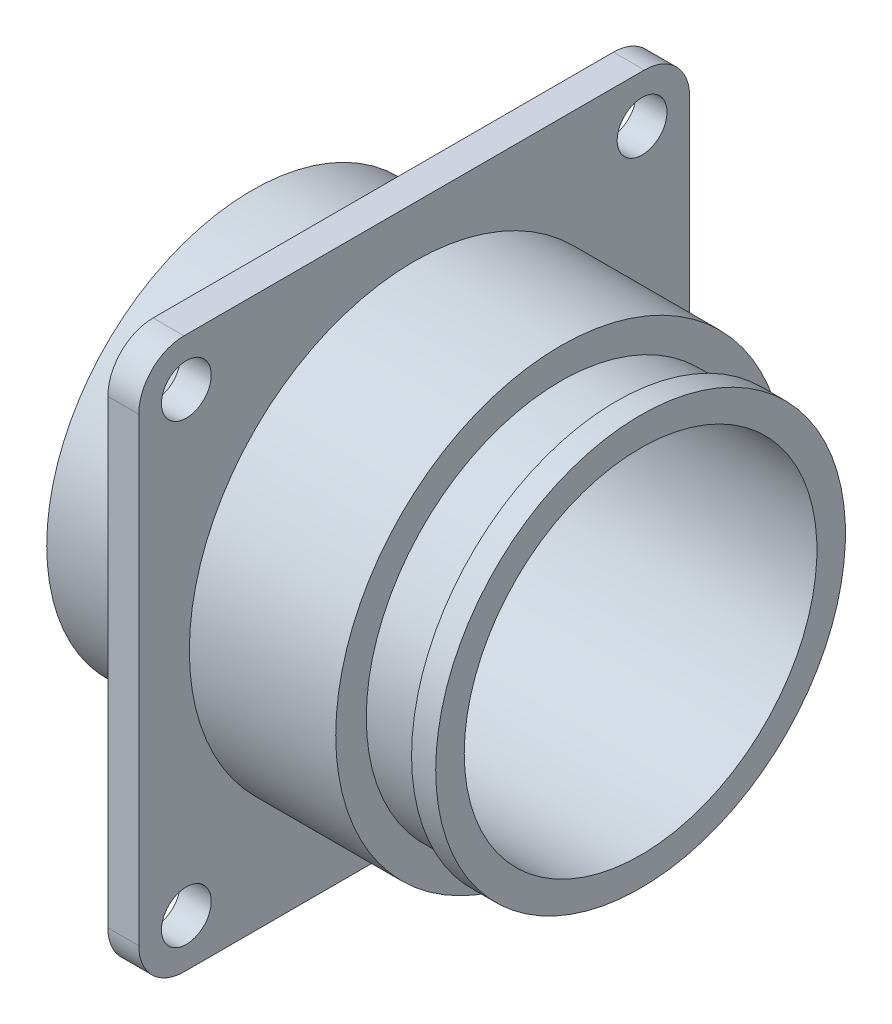
ISO-10303-21;
HEADER;
FILE_DESCRIPTION(('STEP AP214'),'2;1');
FILE_NAME('part.step','',(''),(''),'','','');
FILE_SCHEMA(('AUTOMOTIVE_DESIGN { 1 0 10303 214 1 1 1 1 }'));
ENDSEC;
DATA;
#1=APPLICATION_CONTEXT('core data for automotive mechanical design processes');
#2=APPLICATION_PROTOCOL_DEFINITION('international standard','automotive_design',2000,#1);
#3=PRODUCT_CONTEXT('',#1,'mechanical');
#4=PRODUCT('Part','Part','',(#3));
#5=PRODUCT_RELATED_PRODUCT_CATEGORY('part','',(#4));
#6=PRODUCT_DEFINITION_FORMATION('','',#4);
#7=PRODUCT_DEFINITION_CONTEXT('part definition',#1,'design');
#8=PRODUCT_DEFINITION('design','',#6,#7);
#9=PRODUCT_DEFINITION_SHAPE('','',#8);
#10=(LENGTH_UNIT() NAMED_UNIT(*) SI_UNIT(.MILLI.,.METRE.));
#11=(NAMED_UNIT(*) PLANE_ANGLE_UNIT() SI_UNIT($,.RADIAN.));
#12=(NAMED_UNIT(*) SI_UNIT($,.STERADIAN.) SOLID_ANGLE_UNIT());
#13=UNCERTAINTY_MEASURE_WITH_UNIT(LENGTH_MEASURE(1.E-05),#10,'distance_accuracy_value','');
#14=(GEOMETRIC_REPRESENTATION_CONTEXT(3) GLOBAL_UNCERTAINTY_ASSIGNED_CONTEXT((#13)) GLOBAL_UNIT_ASSIGNED_CONTEXT((#10,
#11,#12)) REPRESENTATION_CONTEXT('',''));
#15=CARTESIAN_POINT('',(0.,0.,0.));
#16=DIRECTION('',(0.,0.,1.));
#17=DIRECTION('',(1.,0.,0.));
#18=AXIS2_PLACEMENT_3D('',#15,#16,#17);
#19=CARTESIAN_POINT('',(2.05,15.25,-15.25));
#20=DIRECTION('',(-1.,0.,0.));
#21=DIRECTION('',(0.,0.,1.));
#22=AXIS2_PLACEMENT_3D('',#19,#20,#21);
#23=PLANE('',#22);
#24=CARTESIAN_POINT('',(2.05,15.1,-15.1));
#25=DIRECTION('',(1.,0.,0.));
#26=DIRECTION('',(0.,0.,-1.));
#27=AXIS2_PLACEMENT_3D('',#24,#25,#26);
#28=CIRCLE('',#27,1.65);
#29=CARTESIAN_POINT('',(2.05,15.1,-16.75));
#30=VERTEX_POINT('',#29);
#31=EDGE_CURVE('E195',#30,#30,#28,.T.);
#32=ORIENTED_EDGE('',*,*,#31,.F.);
#33=EDGE_LOOP('',(#32));
#34=FACE_BOUND('',#33,.T.);
#35=CARTESIAN_POINT('',(2.05,-15.1,15.1));
#36=DIRECTION('',(1.,0.,0.));
#37=DIRECTION('',(0.,0.,-1.));
#38=AXIS2_PLACEMENT_3D('',#35,#36,#37);
#39=CIRCLE('',#38,1.65);
#40=CARTESIAN_POINT('',(2.05,-15.1,13.45));
#41=VERTEX_POINT('',#40);
#42=EDGE_CURVE('E183',#41,#41,#39,.T.);
#43=ORIENTED_EDGE('',*,*,#42,.F.);
#44=EDGE_LOOP('',(#43));
#45=FACE_BOUND('',#44,.T.);
#46=CARTESIAN_POINT('',(2.05,15.25,-15.25));
#47=DIRECTION('',(1.,0.,0.));
#48=DIRECTION('',(0.,0.,1.));
#49=AXIS2_PLACEMENT_3D('',#46,#47,#48);
#50=CIRCLE('',#49,3.);
#51=CARTESIAN_POINT('',(2.05,15.25,-18.25));
#52=VERTEX_POINT('',#51);
#53=CARTESIAN_POINT('',(2.05,18.25,-15.25));
#54=VERTEX_POINT('',#53);
#55=EDGE_CURVE('E146',#52,#54,#50,.T.);
#56=ORIENTED_EDGE('',*,*,#55,.T.);
#57=DIRECTION('',(0.,0.,1.));
#58=VECTOR('',#57,1.);
#59=CARTESIAN_POINT('',(2.05,18.25,15.25));
#60=LINE('',#59,#58);
#61=CARTESIAN_POINT('',(2.05,18.25,15.25));
#62=VERTEX_POINT('',#61);
#63=EDGE_CURVE('E94',#54,#62,#60,.T.);
#64=ORIENTED_EDGE('',*,*,#63,.T.);
#65=CARTESIAN_POINT('',(2.05,15.25,15.25));
#66=DIRECTION('',(1.,0.,0.));
#67=DIRECTION('',(0.,0.,1.));
#68=AXIS2_PLACEMENT_3D('',#65,#66,#67);
#69=CIRCLE('',#68,3.);
#70=CARTESIAN_POINT('',(2.05,15.25,18.25));
#71=VERTEX_POINT('',#70);
#72=EDGE_CURVE('E161',#62,#71,#69,.T.);
#73=ORIENTED_EDGE('',*,*,#72,.T.);
#74=DIRECTION('',(0.,-1.,0.));
#75=VECTOR('',#74,1.);
#76=CARTESIAN_POINT('',(2.05,-15.25,18.25));
#77=LINE('',#76,#75);
#78=CARTESIAN_POINT('',(2.05,-15.25,18.25));
#79=VERTEX_POINT('',#78);
#80=EDGE_CURVE('E174',#71,#79,#77,.T.);
#81=ORIENTED_EDGE('',*,*,#80,.T.);
#82=CARTESIAN_POINT('',(2.05,-15.25,15.25));
#83=DIRECTION('',(1.,0.,0.));
#84=DIRECTION('',(0.,0.,1.));
#85=AXIS2_PLACEMENT_3D('',#82,#83,#84);
#86=CIRCLE('',#85,3.);
#87=CARTESIAN_POINT('',(2.05,-18.25,15.25));
#88=VERTEX_POINT('',#87);
#89=EDGE_CURVE('E113',#79,#88,#86,.T.);
#90=ORIENTED_EDGE('',*,*,#89,.T.);
#91=DIRECTION('',(0.,0.,-1.));
#92=VECTOR('',#91,1.);
#93=CARTESIAN_POINT('',(2.05,-18.25,15.25));
#94=LINE('',#93,#92);
#95=CARTESIAN_POINT('',(2.05,-18.25,-15.25));
#96=VERTEX_POINT('',#95);
#97=EDGE_CURVE('E107',#88,#96,#94,.T.);
#98=ORIENTED_EDGE('',*,*,#97,.T.);
#99=CARTESIAN_POINT('',(2.05,-15.25,-15.25));
#100=DIRECTION('',(1.,0.,0.));
#101=DIRECTION('',(0.,0.,-1.));
#102=AXIS2_PLACEMENT_3D('',#99,#100,#101);
#103=CIRCLE('',#102,3.);
#104=CARTESIAN_POINT('',(2.05,-15.25,-18.25));
#105=VERTEX_POINT('',#104);
#106=EDGE_CURVE('E111',#96,#105,#103,.T.);
#107=ORIENTED_EDGE('',*,*,#106,.T.);
#108=DIRECTION('',(0.,1.,0.));
#109=VECTOR('',#108,1.);
#110=CARTESIAN_POINT('',(2.05,-15.25,-18.25));
#111=LINE('',#110,#109);
#112=EDGE_CURVE('E51',#105,#52,#111,.T.);
#113=ORIENTED_EDGE('',*,*,#112,.T.);
#114=EDGE_LOOP('',(#56,#64,#73,#81,#90,#98,#107,#113));
#115=FACE_BOUND('',#114,.T.);
#116=CARTESIAN_POINT('',(2.05,15.1,15.1));
#117=DIRECTION('',(1.,0.,0.));
#118=DIRECTION('',(0.,0.,-1.));
#119=AXIS2_PLACEMENT_3D('',#116,#117,#118);
#120=CIRCLE('',#119,1.65);
#121=CARTESIAN_POINT('',(2.05,15.1,13.45));
#122=VERTEX_POINT('',#121);
#123=EDGE_CURVE('E135',#122,#122,#120,.T.);
#124=ORIENTED_EDGE('',*,*,#123,.F.);
#125=EDGE_LOOP('',(#124));
#126=FACE_BOUND('',#125,.T.);
#127=CARTESIAN_POINT('',(2.05,-15.1,-15.1));
#128=DIRECTION('',(1.,0.,0.));
#129=DIRECTION('',(0.,0.,-1.));
#130=AXIS2_PLACEMENT_3D('',#127,#128,#129);
#131=CIRCLE('',#130,1.65);
#132=CARTESIAN_POINT('',(2.05,-15.1,-16.75));
#133=VERTEX_POINT('',#132);
#134=EDGE_CURVE('E189',#133,#133,#131,.T.);
#135=ORIENTED_EDGE('',*,*,#134,.F.);
#136=EDGE_LOOP('',(#135));
#137=FACE_BOUND('',#136,.T.);
#138=CARTESIAN_POINT('',(2.05,0.,0.));
#139=DIRECTION('',(1.,0.,0.));
#140=DIRECTION('',(0.,0.,-1.));
#141=AXIS2_PLACEMENT_3D('',#138,#139,#140);
#142=CIRCLE('',#141,14.9);
#143=CARTESIAN_POINT('',(2.05,0.,-14.9));
#144=VERTEX_POINT('',#143);
#145=EDGE_CURVE('E201',#144,#144,#142,.T.);
#146=ORIENTED_EDGE('',*,*,#145,.F.);
#147=EDGE_LOOP('',(#146));
#148=FACE_BOUND('',#147,.T.);
#149=ADVANCED_FACE('F34',(#34,#45,#115,#126,#137,#148),#23,.F.);
#150=CARTESIAN_POINT('',(0.,15.25,-15.25));
#151=DIRECTION('',(-1.,0.,0.));
#152=DIRECTION('',(0.,0.,1.));
#153=AXIS2_PLACEMENT_3D('',#150,#151,#152);
#154=PLANE('',#153);
#155=CARTESIAN_POINT('',(0.,15.1,-15.1));
#156=DIRECTION('',(1.,0.,0.));
#157=DIRECTION('',(0.,0.,-1.));
#158=AXIS2_PLACEMENT_3D('',#155,#156,#157);
#159=CIRCLE('',#158,1.65);
#160=CARTESIAN_POINT('',(0.,15.1,-16.75));
#161=VERTEX_POINT('',#160);
#162=EDGE_CURVE('E198',#161,#161,#159,.T.);
#163=ORIENTED_EDGE('',*,*,#162,.T.);
#164=EDGE_LOOP('',(#163));
#165=FACE_BOUND('',#164,.T.);
#166=CARTESIAN_POINT('',(0.,-15.1,15.1));
#167=DIRECTION('',(1.,0.,0.));
#168=DIRECTION('',(0.,0.,-1.));
#169=AXIS2_PLACEMENT_3D('',#166,#167,#168);
#170=CIRCLE('',#169,1.65);
#171=CARTESIAN_POINT('',(0.,-15.1,13.45));
#172=VERTEX_POINT('',#171);
#173=EDGE_CURVE('E186',#172,#172,#170,.T.);
#174=ORIENTED_EDGE('',*,*,#173,.T.);
#175=EDGE_LOOP('',(#174));
#176=FACE_BOUND('',#175,.T.);
#177=CARTESIAN_POINT('',(0.,15.25,-15.25));
#178=DIRECTION('',(1.,0.,0.));
#179=DIRECTION('',(0.,0.,1.));
#180=AXIS2_PLACEMENT_3D('',#177,#178,#179);
#181=CIRCLE('',#180,3.);
#182=CARTESIAN_POINT('',(0.,15.25,-18.25));
#183=VERTEX_POINT('',#182);
#184=CARTESIAN_POINT('',(0.,18.25,-15.25));
#185=VERTEX_POINT('',#184);
#186=EDGE_CURVE('E131',#183,#185,#181,.T.);
#187=ORIENTED_EDGE('',*,*,#186,.F.);
#188=DIRECTION('',(0.,1.,0.));
#189=VECTOR('',#188,1.);
#190=CARTESIAN_POINT('',(0.,-15.25,-18.25));
#191=LINE('',#190,#189);
#192=CARTESIAN_POINT('',(0.,-15.25,-18.25));
#193=VERTEX_POINT('',#192);
#194=EDGE_CURVE('E86',#193,#183,#191,.T.);
#195=ORIENTED_EDGE('',*,*,#194,.F.);
#196=CARTESIAN_POINT('',(0.,-15.25,-15.25));
#197=DIRECTION('',(1.,0.,0.));
#198=DIRECTION('',(0.,0.,-1.));
#199=AXIS2_PLACEMENT_3D('',#196,#197,#198);
#200=CIRCLE('',#199,3.);
#201=CARTESIAN_POINT('',(0.,-18.25,-15.25));
#202=VERTEX_POINT('',#201);
#203=EDGE_CURVE('E80',#202,#193,#200,.T.);
#204=ORIENTED_EDGE('',*,*,#203,.F.);
#205=DIRECTION('',(0.,0.,-1.));
#206=VECTOR('',#205,1.);
#207=CARTESIAN_POINT('',(0.,-18.25,15.25));
#208=LINE('',#207,#206);
#209=CARTESIAN_POINT('',(0.,-18.25,15.25));
#210=VERTEX_POINT('',#209);
#211=EDGE_CURVE('E121',#210,#202,#208,.T.);
#212=ORIENTED_EDGE('',*,*,#211,.F.);
#213=CARTESIAN_POINT('',(0.,-15.25,15.25));
#214=DIRECTION('',(1.,0.,0.));
#215=DIRECTION('',(0.,0.,1.));
#216=AXIS2_PLACEMENT_3D('',#213,#214,#215);
#217=CIRCLE('',#216,3.);
#218=CARTESIAN_POINT('',(0.,-15.25,18.25));
#219=VERTEX_POINT('',#218);
#220=EDGE_CURVE('E141',#219,#210,#217,.T.);
#221=ORIENTED_EDGE('',*,*,#220,.F.);
#222=DIRECTION('',(0.,-1.,0.));
#223=VECTOR('',#222,1.);
#224=CARTESIAN_POINT('',(0.,-15.25,18.25));
#225=LINE('',#224,#223);
#226=CARTESIAN_POINT('',(0.,15.25,18.25));
#227=VERTEX_POINT('',#226);
#228=EDGE_CURVE('E139',#227,#219,#225,.T.);
#229=ORIENTED_EDGE('',*,*,#228,.F.);
#230=CARTESIAN_POINT('',(0.,15.25,15.25));
#231=DIRECTION('',(1.,0.,0.));
#232=DIRECTION('',(0.,0.,1.));
#233=AXIS2_PLACEMENT_3D('',#230,#231,#232);
#234=CIRCLE('',#233,3.);
#235=CARTESIAN_POINT('',(0.,18.25,15.25));
#236=VERTEX_POINT('',#235);
#237=EDGE_CURVE('E137',#236,#227,#234,.T.);
#238=ORIENTED_EDGE('',*,*,#237,.F.);
#239=DIRECTION('',(0.,0.,1.));
#240=VECTOR('',#239,1.);
#241=CARTESIAN_POINT('',(0.,18.25,15.25));
#242=LINE('',#241,#240);
#243=EDGE_CURVE('E134',#185,#236,#242,.T.);
#244=ORIENTED_EDGE('',*,*,#243,.F.);
#245=EDGE_LOOP('',(#187,#195,#204,#212,#221,#229,#238,#244));
#246=FACE_BOUND('',#245,.T.);
#247=CARTESIAN_POINT('',(0.,15.1,15.1));
#248=DIRECTION('',(1.,0.,0.));
#249=DIRECTION('',(0.,0.,-1.));
#250=AXIS2_PLACEMENT_3D('',#247,#248,#249);
#251=CIRCLE('',#250,1.65);
#252=CARTESIAN_POINT('',(0.,15.1,13.45));
#253=VERTEX_POINT('',#252);
#254=EDGE_CURVE('E180',#253,#253,#251,.T.);
#255=ORIENTED_EDGE('',*,*,#254,.T.);
#256=EDGE_LOOP('',(#255));
#257=FACE_BOUND('',#256,.T.);
#258=CARTESIAN_POINT('',(0.,-15.1,-15.1));
#259=DIRECTION('',(1.,0.,0.));
#260=DIRECTION('',(0.,0.,-1.));
#261=AXIS2_PLACEMENT_3D('',#258,#259,#260);
#262=CIRCLE('',#261,1.65);
#263=CARTESIAN_POINT('',(0.,-15.1,-16.75));
#264=VERTEX_POINT('',#263);
#265=EDGE_CURVE('E192',#264,#264,#262,.T.);
#266=ORIENTED_EDGE('',*,*,#265,.T.);
#267=EDGE_LOOP('',(#266));
#268=FACE_BOUND('',#267,.T.);
#269=CARTESIAN_POINT('',(0.,0.,0.));
#270=DIRECTION('',(-1.,0.,0.));
#271=DIRECTION('',(0.,0.,1.));
#272=AXIS2_PLACEMENT_3D('',#269,#270,#271);
#273=CIRCLE('',#272,13.6);
#274=CARTESIAN_POINT('',(0.,0.,13.6));
#275=VERTEX_POINT('',#274);
#276=EDGE_CURVE('E233',#275,#275,#273,.T.);
#277=ORIENTED_EDGE('',*,*,#276,.F.);
#278=EDGE_LOOP('',(#277));
#279=FACE_BOUND('',#278,.T.);
#280=ADVANCED_FACE('F165',(#165,#176,#246,#257,#268,#279),#154,.T.);
#281=CARTESIAN_POINT('',(2.05,15.25,-15.25));
#282=DIRECTION('',(-1.,0.,0.));
#283=DIRECTION('',(0.,0.,1.));
#284=AXIS2_PLACEMENT_3D('',#281,#282,#283);
#285=CYLINDRICAL_SURFACE('',#284,3.);
#286=ORIENTED_EDGE('',*,*,#186,.T.);
#287=DIRECTION('',(-1.,0.,0.));
#288=VECTOR('',#287,1.);
#289=CARTESIAN_POINT('',(2.05,18.25,-15.25));
#290=LINE('',#289,#288);
#291=EDGE_CURVE('E11',#54,#185,#290,.T.);
#292=ORIENTED_EDGE('',*,*,#291,.F.);
#293=ORIENTED_EDGE('',*,*,#55,.F.);
#294=DIRECTION('',(-1.,0.,0.));
#295=VECTOR('',#294,1.);
#296=CARTESIAN_POINT('',(2.05,15.25,-18.25));
#297=LINE('',#296,#295);
#298=EDGE_CURVE('E127',#52,#183,#297,.T.);
#299=ORIENTED_EDGE('',*,*,#298,.T.);
#300=EDGE_LOOP('',(#286,#292,#293,#299));
#301=FACE_BOUND('',#300,.T.);
#302=ADVANCED_FACE('F36',(#301),#285,.T.);
#303=CARTESIAN_POINT('',(2.05,18.25,15.25));
#304=DIRECTION('',(0.,-1.,0.));
#305=DIRECTION('',(0.,0.,-1.));
#306=AXIS2_PLACEMENT_3D('',#303,#304,#305);
#307=PLANE('',#306);
#308=ORIENTED_EDGE('',*,*,#243,.T.);
#309=DIRECTION('',(-1.,0.,0.));
#310=VECTOR('',#309,1.);
#311=CARTESIAN_POINT('',(2.05,18.25,15.25));
#312=LINE('',#311,#310);
#313=EDGE_CURVE('E43',#62,#236,#312,.T.);
#314=ORIENTED_EDGE('',*,*,#313,.F.);
#315=ORIENTED_EDGE('',*,*,#63,.F.);
#316=ORIENTED_EDGE('',*,*,#291,.T.);
#317=EDGE_LOOP('',(#308,#314,#315,#316));
#318=FACE_BOUND('',#317,.T.);
#319=ADVANCED_FACE('F256',(#318),#307,.F.);
#320=CARTESIAN_POINT('',(2.05,15.25,15.25));
#321=DIRECTION('',(-1.,0.,0.));
#322=DIRECTION('',(0.,0.,1.));
#323=AXIS2_PLACEMENT_3D('',#320,#321,#322);
#324=CYLINDRICAL_SURFACE('',#323,3.);
#325=ORIENTED_EDGE('',*,*,#237,.T.);
#326=DIRECTION('',(-1.,0.,0.));
#327=VECTOR('',#326,1.);
#328=CARTESIAN_POINT('',(2.05,15.25,18.25));
#329=LINE('',#328,#327);
#330=EDGE_CURVE('E153',#71,#227,#329,.T.);
#331=ORIENTED_EDGE('',*,*,#330,.F.);
#332=ORIENTED_EDGE('',*,*,#72,.F.);
#333=ORIENTED_EDGE('',*,*,#313,.T.);
#334=EDGE_LOOP('',(#325,#331,#332,#333));
#335=FACE_BOUND('',#334,.T.);
#336=ADVANCED_FACE('F159',(#335),#324,.T.);
#337=CARTESIAN_POINT('',(2.05,-15.25,18.25));
#338=DIRECTION('',(0.,0.,-1.));
#339=DIRECTION('',(-1.,0.,0.));
#340=AXIS2_PLACEMENT_3D('',#337,#338,#339);
#341=PLANE('',#340);
#342=ORIENTED_EDGE('',*,*,#228,.T.);
#343=DIRECTION('',(-1.,0.,0.));
#344=VECTOR('',#343,1.);
#345=CARTESIAN_POINT('',(2.05,-15.25,18.25));
#346=LINE('',#345,#344);
#347=EDGE_CURVE('E150',#79,#219,#346,.T.);
#348=ORIENTED_EDGE('',*,*,#347,.F.);
#349=ORIENTED_EDGE('',*,*,#80,.F.);
#350=ORIENTED_EDGE('',*,*,#330,.T.);
#351=EDGE_LOOP('',(#342,#348,#349,#350));
#352=FACE_BOUND('',#351,.T.);
#353=ADVANCED_FACE('F170',(#352),#341,.F.);
#354=CARTESIAN_POINT('',(2.05,-15.25,15.25));
#355=DIRECTION('',(-1.,0.,0.));
#356=DIRECTION('',(0.,0.,1.));
#357=AXIS2_PLACEMENT_3D('',#354,#355,#356);
#358=CYLINDRICAL_SURFACE('',#357,3.);
#359=ORIENTED_EDGE('',*,*,#220,.T.);
#360=DIRECTION('',(-1.,0.,0.));
#361=VECTOR('',#360,1.);
#362=CARTESIAN_POINT('',(2.05,-18.25,15.25));
#363=LINE('',#362,#361);
#364=EDGE_CURVE('E122',#88,#210,#363,.T.);
#365=ORIENTED_EDGE('',*,*,#364,.F.);
#366=ORIENTED_EDGE('',*,*,#89,.F.);
#367=ORIENTED_EDGE('',*,*,#347,.T.);
#368=EDGE_LOOP('',(#359,#365,#366,#367));
#369=FACE_BOUND('',#368,.T.);
#370=ADVANCED_FACE('F173',(#369),#358,.T.);
#371=CARTESIAN_POINT('',(2.05,-18.25,15.25));
#372=DIRECTION('',(0.,1.,0.));
#373=DIRECTION('',(0.,0.,1.));
#374=AXIS2_PLACEMENT_3D('',#371,#372,#373);
#375=PLANE('',#374);
#376=ORIENTED_EDGE('',*,*,#211,.T.);
#377=DIRECTION('',(-1.,0.,0.));
#378=VECTOR('',#377,1.);
#379=CARTESIAN_POINT('',(2.05,-18.25,-15.25));
#380=LINE('',#379,#378);
#381=EDGE_CURVE('E118',#96,#202,#380,.T.);
#382=ORIENTED_EDGE('',*,*,#381,.F.);
#383=ORIENTED_EDGE('',*,*,#97,.F.);
#384=ORIENTED_EDGE('',*,*,#364,.T.);
#385=EDGE_LOOP('',(#376,#382,#383,#384));
#386=FACE_BOUND('',#385,.T.);
#387=ADVANCED_FACE('F119',(#386),#375,.F.);
#388=CARTESIAN_POINT('',(2.05,-15.25,-15.25));
#389=DIRECTION('',(-1.,0.,0.));
#390=DIRECTION('',(0.,0.,1.));
#391=AXIS2_PLACEMENT_3D('',#388,#389,#390);
#392=CYLINDRICAL_SURFACE('',#391,3.);
#393=ORIENTED_EDGE('',*,*,#203,.T.);
#394=DIRECTION('',(-1.,0.,0.));
#395=VECTOR('',#394,1.);
#396=CARTESIAN_POINT('',(2.05,-15.25,-18.25));
#397=LINE('',#396,#395);
#398=EDGE_CURVE('E123',#105,#193,#397,.T.);
#399=ORIENTED_EDGE('',*,*,#398,.F.);
#400=ORIENTED_EDGE('',*,*,#106,.F.);
#401=ORIENTED_EDGE('',*,*,#381,.T.);
#402=EDGE_LOOP('',(#393,#399,#400,#401));
#403=FACE_BOUND('',#402,.T.);
#404=ADVANCED_FACE('F125',(#403),#392,.T.);
#405=CARTESIAN_POINT('',(2.05,-15.25,-18.25));
#406=DIRECTION('',(0.,0.,1.));
#407=DIRECTION('',(1.,0.,0.));
#408=AXIS2_PLACEMENT_3D('',#405,#406,#407);
#409=PLANE('',#408);
#410=ORIENTED_EDGE('',*,*,#194,.T.);
#411=ORIENTED_EDGE('',*,*,#298,.F.);
#412=ORIENTED_EDGE('',*,*,#112,.F.);
#413=ORIENTED_EDGE('',*,*,#398,.T.);
#414=EDGE_LOOP('',(#410,#411,#412,#413));
#415=FACE_BOUND('',#414,.T.);
#416=ADVANCED_FACE('F263',(#415),#409,.F.);
#417=CARTESIAN_POINT('',(2.05,15.1,15.1));
#418=DIRECTION('',(-1.,0.,0.));
#419=DIRECTION('',(0.,0.,1.));
#420=AXIS2_PLACEMENT_3D('',#417,#418,#419);
#421=CYLINDRICAL_SURFACE('',#420,1.65);
#422=ORIENTED_EDGE('',*,*,#123,.T.);
#423=EDGE_LOOP('',(#422));
#424=FACE_BOUND('',#423,.T.);
#425=ORIENTED_EDGE('',*,*,#254,.F.);
#426=EDGE_LOOP('',(#425));
#427=FACE_BOUND('',#426,.T.);
#428=ADVANCED_FACE('F266',(#424,#427),#421,.F.);
#429=CARTESIAN_POINT('',(2.05,-15.1,15.1));
#430=DIRECTION('',(-1.,0.,0.));
#431=DIRECTION('',(0.,0.,1.));
#432=AXIS2_PLACEMENT_3D('',#429,#430,#431);
#433=CYLINDRICAL_SURFACE('',#432,1.65);
#434=ORIENTED_EDGE('',*,*,#42,.T.);
#435=EDGE_LOOP('',(#434));
#436=FACE_BOUND('',#435,.T.);
#437=ORIENTED_EDGE('',*,*,#173,.F.);
#438=EDGE_LOOP('',(#437));
#439=FACE_BOUND('',#438,.T.);
#440=ADVANCED_FACE('F313',(#436,#439),#433,.F.);
#441=CARTESIAN_POINT('',(2.05,-15.1,-15.1));
#442=DIRECTION('',(-1.,0.,0.));
#443=DIRECTION('',(0.,0.,1.));
#444=AXIS2_PLACEMENT_3D('',#441,#442,#443);
#445=CYLINDRICAL_SURFACE('',#444,1.65);
#446=ORIENTED_EDGE('',*,*,#134,.T.);
#447=EDGE_LOOP('',(#446));
#448=FACE_BOUND('',#447,.T.);
#449=ORIENTED_EDGE('',*,*,#265,.F.);
#450=EDGE_LOOP('',(#449));
#451=FACE_BOUND('',#450,.T.);
#452=ADVANCED_FACE('F320',(#448,#451),#445,.F.);
#453=CARTESIAN_POINT('',(2.05,15.1,-15.1));
#454=DIRECTION('',(-1.,0.,0.));
#455=DIRECTION('',(0.,0.,1.));
#456=AXIS2_PLACEMENT_3D('',#453,#454,#455);
#457=CYLINDRICAL_SURFACE('',#456,1.65);
#458=ORIENTED_EDGE('',*,*,#31,.T.);
#459=EDGE_LOOP('',(#458));
#460=FACE_BOUND('',#459,.T.);
#461=ORIENTED_EDGE('',*,*,#162,.F.);
#462=EDGE_LOOP('',(#461));
#463=FACE_BOUND('',#462,.T.);
#464=ADVANCED_FACE('F328',(#460,#463),#457,.F.);
#465=CARTESIAN_POINT('',(0.,0.,0.));
#466=DIRECTION('',(-1.,0.,0.));
#467=DIRECTION('',(0.,0.,1.));
#468=AXIS2_PLACEMENT_3D('',#465,#466,#467);
#469=CYLINDRICAL_SURFACE('',#468,14.9);
#470=CARTESIAN_POINT('',(11.75,0.,0.));
#471=DIRECTION('',(-1.,0.,0.));
#472=DIRECTION('',(0.,0.,1.));
#473=AXIS2_PLACEMENT_3D('',#470,#471,#472);
#474=CIRCLE('',#473,14.9);
#475=CARTESIAN_POINT('',(11.75,0.,14.9));
#476=VERTEX_POINT('',#475);
#477=EDGE_CURVE('E230',#476,#476,#474,.T.);
#478=ORIENTED_EDGE('',*,*,#477,.T.);
#479=EDGE_LOOP('',(#478));
#480=FACE_BOUND('',#479,.T.);
#481=ORIENTED_EDGE('',*,*,#145,.T.);
#482=EDGE_LOOP('',(#481));
#483=FACE_BOUND('',#482,.T.);
#484=ADVANCED_FACE('F336',(#480,#483),#469,.T.);
#485=CARTESIAN_POINT('',(-8.7,13.6,0.));
#486=DIRECTION('',(1.,0.,0.));
#487=DIRECTION('',(0.,0.,-1.));
#488=AXIS2_PLACEMENT_3D('',#485,#486,#487);
#489=PLANE('',#488);
#490=CARTESIAN_POINT('',(-8.7,0.,0.));
#491=DIRECTION('',(-1.,0.,0.));
#492=DIRECTION('',(0.,0.,1.));
#493=AXIS2_PLACEMENT_3D('',#490,#491,#492);
#494=CIRCLE('',#493,8.99999999999999);
#495=CARTESIAN_POINT('',(-8.7,0.,8.99999999999999));
#496=VERTEX_POINT('',#495);
#497=EDGE_CURVE('E206',#496,#496,#494,.T.);
#498=ORIENTED_EDGE('',*,*,#497,.F.);
#499=EDGE_LOOP('',(#498));
#500=FACE_BOUND('',#499,.T.);
#501=CARTESIAN_POINT('',(-8.7,0.,0.));
#502=DIRECTION('',(-1.,0.,0.));
#503=DIRECTION('',(0.,0.,1.));
#504=AXIS2_PLACEMENT_3D('',#501,#502,#503);
#505=CIRCLE('',#504,13.6);
#506=CARTESIAN_POINT('',(-8.7,0.,13.6));
#507=VERTEX_POINT('',#506);
#508=EDGE_CURVE('E236',#507,#507,#505,.T.);
#509=ORIENTED_EDGE('',*,*,#508,.T.);
#510=EDGE_LOOP('',(#509));
#511=FACE_BOUND('',#510,.T.);
#512=ADVANCED_FACE('F240',(#500,#511),#489,.F.);
#513=CARTESIAN_POINT('',(0.,0.,0.));
#514=DIRECTION('',(-1.,0.,0.));
#515=DIRECTION('',(0.,0.,1.));
#516=AXIS2_PLACEMENT_3D('',#513,#514,#515);
#517=CYLINDRICAL_SURFACE('',#516,8.99999999999999);
#518=CARTESIAN_POINT('',(-3.25,0.,0.));
#519=DIRECTION('',(-1.,0.,0.));
#520=DIRECTION('',(0.,0.,1.));
#521=AXIS2_PLACEMENT_3D('',#518,#519,#520);
#522=CIRCLE('',#521,8.99999999999999);
#523=CARTESIAN_POINT('',(-3.25,0.,8.99999999999999));
#524=VERTEX_POINT('',#523);
#525=EDGE_CURVE('E209',#524,#524,#522,.T.);
#526=ORIENTED_EDGE('',*,*,#525,.F.);
#527=EDGE_LOOP('',(#526));
#528=FACE_BOUND('',#527,.T.);
#529=ORIENTED_EDGE('',*,*,#497,.T.);
#530=EDGE_LOOP('',(#529));
#531=FACE_BOUND('',#530,.T.);
#532=ADVANCED_FACE('F351',(#528,#531),#517,.F.);
#533=CARTESIAN_POINT('',(-3.25,11.685,0.));
#534=DIRECTION('',(-1.,0.,0.));
#535=DIRECTION('',(0.,0.,1.));
#536=AXIS2_PLACEMENT_3D('',#533,#534,#535);
#537=PLANE('',#536);
#538=CARTESIAN_POINT('',(-3.25,0.,0.));
#539=DIRECTION('',(-1.,0.,0.));
#540=DIRECTION('',(0.,0.,1.));
#541=AXIS2_PLACEMENT_3D('',#538,#539,#540);
#542=CIRCLE('',#541,11.685);
#543=CARTESIAN_POINT('',(-3.25,0.,11.685));
#544=VERTEX_POINT('',#543);
#545=EDGE_CURVE('E212',#544,#544,#542,.T.);
#546=ORIENTED_EDGE('',*,*,#545,.F.);
#547=EDGE_LOOP('',(#546));
#548=FACE_BOUND('',#547,.T.);
#549=ORIENTED_EDGE('',*,*,#525,.T.);
#550=EDGE_LOOP('',(#549));
#551=FACE_BOUND('',#550,.T.);
#552=ADVANCED_FACE('F359',(#548,#551),#537,.F.);
#553=CARTESIAN_POINT('',(0.,0.,0.));
#554=DIRECTION('',(-1.,0.,0.));
#555=DIRECTION('',(0.,0.,1.));
#556=AXIS2_PLACEMENT_3D('',#553,#554,#555);
#557=CYLINDRICAL_SURFACE('',#556,11.685);
#558=CARTESIAN_POINT('',(17.05,0.,0.));
#559=DIRECTION('',(-1.,0.,0.));
#560=DIRECTION('',(0.,0.,1.));
#561=AXIS2_PLACEMENT_3D('',#558,#559,#560);
#562=CIRCLE('',#561,11.685);
#563=CARTESIAN_POINT('',(17.05,0.,11.685));
#564=VERTEX_POINT('',#563);
#565=EDGE_CURVE('E215',#564,#564,#562,.T.);
#566=ORIENTED_EDGE('',*,*,#565,.F.);
#567=EDGE_LOOP('',(#566));
#568=FACE_BOUND('',#567,.T.);
#569=ORIENTED_EDGE('',*,*,#545,.T.);
#570=EDGE_LOOP('',(#569));
#571=FACE_BOUND('',#570,.T.);
#572=ADVANCED_FACE('F367',(#568,#571),#557,.F.);
#573=CARTESIAN_POINT('',(17.05,13.575,0.));
#574=DIRECTION('',(-1.,0.,0.));
#575=DIRECTION('',(0.,0.,1.));
#576=AXIS2_PLACEMENT_3D('',#573,#574,#575);
#577=PLANE('',#576);
#578=CARTESIAN_POINT('',(17.05,0.,0.));
#579=DIRECTION('',(-1.,0.,0.));
#580=DIRECTION('',(0.,0.,1.));
#581=AXIS2_PLACEMENT_3D('',#578,#579,#580);
#582=CIRCLE('',#581,13.575);
#583=CARTESIAN_POINT('',(17.05,0.,13.575));
#584=VERTEX_POINT('',#583);
#585=EDGE_CURVE('E218',#584,#584,#582,.T.);
#586=ORIENTED_EDGE('',*,*,#585,.F.);
#587=EDGE_LOOP('',(#586));
#588=FACE_BOUND('',#587,.T.);
#589=ORIENTED_EDGE('',*,*,#565,.T.);
#590=EDGE_LOOP('',(#589));
#591=FACE_BOUND('',#590,.T.);
#592=ADVANCED_FACE('F375',(#588,#591),#577,.F.);
#593=CARTESIAN_POINT('',(0.,0.,0.));
#594=DIRECTION('',(-1.,0.,0.));
#595=DIRECTION('',(0.,0.,1.));
#596=AXIS2_PLACEMENT_3D('',#593,#594,#595);
#597=CYLINDRICAL_SURFACE('',#596,13.575);
#598=CARTESIAN_POINT('',(15.45,0.,0.));
#599=DIRECTION('',(-1.,0.,0.));
#600=DIRECTION('',(0.,0.,1.));
#601=AXIS2_PLACEMENT_3D('',#598,#599,#600);
#602=CIRCLE('',#601,13.575);
#603=CARTESIAN_POINT('',(15.45,0.,13.575));
#604=VERTEX_POINT('',#603);
#605=EDGE_CURVE('E221',#604,#604,#602,.T.);
#606=ORIENTED_EDGE('',*,*,#605,.F.);
#607=EDGE_LOOP('',(#606));
#608=FACE_BOUND('',#607,.T.);
#609=ORIENTED_EDGE('',*,*,#585,.T.);
#610=EDGE_LOOP('',(#609));
#611=FACE_BOUND('',#610,.T.);
#612=ADVANCED_FACE('F383',(#608,#611),#597,.T.);
#613=CARTESIAN_POINT('',(15.45,13.575,0.));
#614=DIRECTION('',(1.,0.,0.));
#615=DIRECTION('',(0.,0.,-1.));
#616=AXIS2_PLACEMENT_3D('',#613,#614,#615);
#617=PLANE('',#616);
#618=CARTESIAN_POINT('',(15.45,0.,0.));
#619=DIRECTION('',(-1.,0.,0.));
#620=DIRECTION('',(0.,0.,1.));
#621=AXIS2_PLACEMENT_3D('',#618,#619,#620);
#622=CIRCLE('',#621,12.875);
#623=CARTESIAN_POINT('',(15.45,0.,12.875));
#624=VERTEX_POINT('',#623);
#625=EDGE_CURVE('E224',#624,#624,#622,.T.);
#626=ORIENTED_EDGE('',*,*,#625,.F.);
#627=EDGE_LOOP('',(#626));
#628=FACE_BOUND('',#627,.T.);
#629=ORIENTED_EDGE('',*,*,#605,.T.);
#630=EDGE_LOOP('',(#629));
#631=FACE_BOUND('',#630,.T.);
#632=ADVANCED_FACE('F391',(#628,#631),#617,.F.);
#633=CARTESIAN_POINT('',(0.,0.,0.));
#634=DIRECTION('',(-1.,0.,0.));
#635=DIRECTION('',(0.,0.,1.));
#636=AXIS2_PLACEMENT_3D('',#633,#634,#635);
#637=CYLINDRICAL_SURFACE('',#636,12.875);
#638=CARTESIAN_POINT('',(11.75,0.,0.));
#639=DIRECTION('',(-1.,0.,0.));
#640=DIRECTION('',(0.,0.,1.));
#641=AXIS2_PLACEMENT_3D('',#638,#639,#640);
#642=CIRCLE('',#641,12.875);
#643=CARTESIAN_POINT('',(11.75,0.,12.875));
#644=VERTEX_POINT('',#643);
#645=EDGE_CURVE('E227',#644,#644,#642,.T.);
#646=ORIENTED_EDGE('',*,*,#645,.F.);
#647=EDGE_LOOP('',(#646));
#648=FACE_BOUND('',#647,.T.);
#649=ORIENTED_EDGE('',*,*,#625,.T.);
#650=EDGE_LOOP('',(#649));
#651=FACE_BOUND('',#650,.T.);
#652=ADVANCED_FACE('F399',(#648,#651),#637,.T.);
#653=CARTESIAN_POINT('',(11.75,14.9,0.));
#654=DIRECTION('',(-1.,0.,0.));
#655=DIRECTION('',(0.,0.,1.));
#656=AXIS2_PLACEMENT_3D('',#653,#654,#655);
#657=PLANE('',#656);
#658=ORIENTED_EDGE('',*,*,#477,.F.);
#659=EDGE_LOOP('',(#658));
#660=FACE_BOUND('',#659,.T.);
#661=ORIENTED_EDGE('',*,*,#645,.T.);
#662=EDGE_LOOP('',(#661));
#663=FACE_BOUND('',#662,.T.);
#664=ADVANCED_FACE('F245',(#660,#663),#657,.F.);
#665=CARTESIAN_POINT('',(0.,0.,0.));
#666=DIRECTION('',(-1.,0.,0.));
#667=DIRECTION('',(0.,0.,1.));
#668=AXIS2_PLACEMENT_3D('',#665,#666,#667);
#669=CYLINDRICAL_SURFACE('',#668,13.6);
#670=ORIENTED_EDGE('',*,*,#508,.F.);
#671=EDGE_LOOP('',(#670));
#672=FACE_BOUND('',#671,.T.);
#673=ORIENTED_EDGE('',*,*,#276,.T.);
#674=EDGE_LOOP('',(#673));
#675=FACE_BOUND('',#674,.T.);
#676=ADVANCED_FACE('F242',(#672,#675),#669,.T.);
#677=CLOSED_SHELL('',(#149,#280,#302,#319,#336,#353,#370,#387,#404,#416,#428,#440,#452,#464,
#484,#512,#532,#552,#572,#592,#612,#632,#652,#664,#676));
#678=MANIFOLD_SOLID_BREP('B2',#677);
#679=ADVANCED_BREP_SHAPE_REPRESENTATION('',(#18,#678),#14);
#680=SHAPE_DEFINITION_REPRESENTATION(#9,#679);
ENDSEC;
END-ISO-10303-21;
